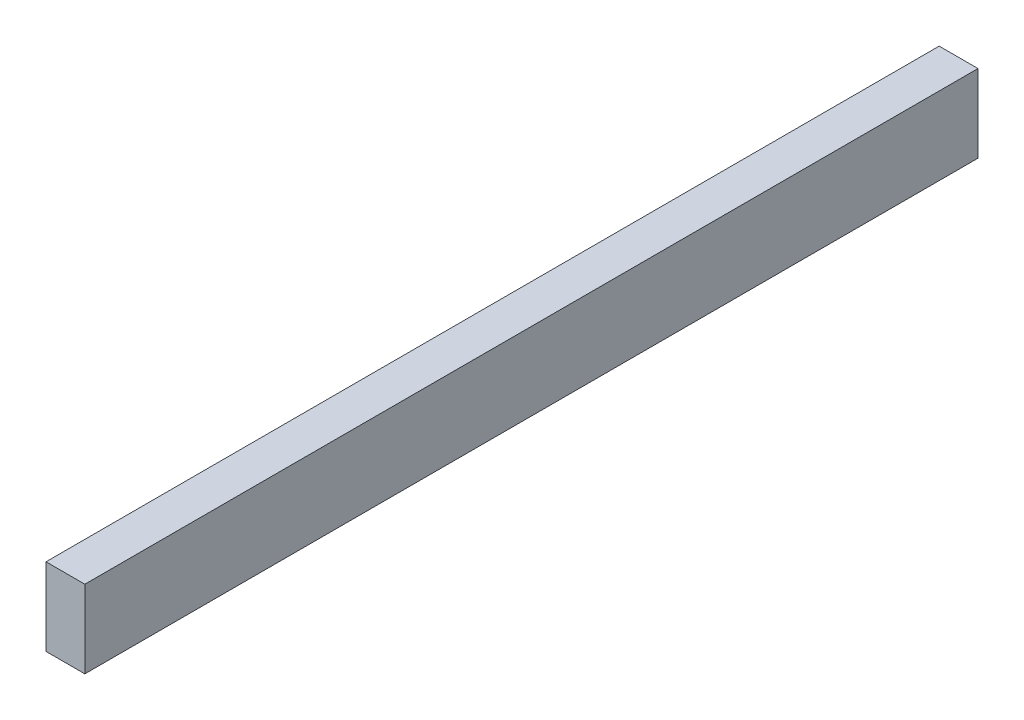
ISO-10303-21;
HEADER;
FILE_DESCRIPTION(('STEP AP214'),'2;1');
FILE_NAME('part.step','',(''),(''),'','','');
FILE_SCHEMA(('AUTOMOTIVE_DESIGN { 1 0 10303 214 1 1 1 1 }'));
ENDSEC;
DATA;
#1=APPLICATION_CONTEXT('core data for automotive mechanical design processes');
#2=APPLICATION_PROTOCOL_DEFINITION('international standard','automotive_design',2000,#1);
#3=PRODUCT_CONTEXT('',#1,'mechanical');
#4=PRODUCT('Part','Part','',(#3));
#5=PRODUCT_RELATED_PRODUCT_CATEGORY('part','',(#4));
#6=PRODUCT_DEFINITION_FORMATION('','',#4);
#7=PRODUCT_DEFINITION_CONTEXT('part definition',#1,'design');
#8=PRODUCT_DEFINITION('design','',#6,#7);
#9=PRODUCT_DEFINITION_SHAPE('','',#8);
#10=(LENGTH_UNIT() NAMED_UNIT(*) SI_UNIT(.MILLI.,.METRE.));
#11=(NAMED_UNIT(*) PLANE_ANGLE_UNIT() SI_UNIT($,.RADIAN.));
#12=(NAMED_UNIT(*) SI_UNIT($,.STERADIAN.) SOLID_ANGLE_UNIT());
#13=UNCERTAINTY_MEASURE_WITH_UNIT(LENGTH_MEASURE(1.E-05),#10,'distance_accuracy_value','');
#14=(GEOMETRIC_REPRESENTATION_CONTEXT(3) GLOBAL_UNCERTAINTY_ASSIGNED_CONTEXT((#13)) GLOBAL_UNIT_ASSIGNED_CONTEXT((#10,
#11,#12)) REPRESENTATION_CONTEXT('',''));
#15=CARTESIAN_POINT('',(0.,0.,0.));
#16=DIRECTION('',(0.,0.,1.));
#17=DIRECTION('',(1.,0.,0.));
#18=AXIS2_PLACEMENT_3D('',#15,#16,#17);
#19=CARTESIAN_POINT('',(12.7,25.4,584.2));
#20=DIRECTION('',(-1.,0.,0.));
#21=DIRECTION('',(0.,-1.,0.));
#22=AXIS2_PLACEMENT_3D('',#19,#20,#21);
#23=PLANE('',#22);
#24=DIRECTION('',(0.,1.,0.));
#25=VECTOR('',#24,1.);
#26=CARTESIAN_POINT('',(12.7,25.4,0.));
#27=LINE('',#26,#25);
#28=CARTESIAN_POINT('',(12.7,-25.4,0.));
#29=VERTEX_POINT('',#28);
#30=CARTESIAN_POINT('',(12.7,25.4,0.));
#31=VERTEX_POINT('',#30);
#32=EDGE_CURVE('E113',#29,#31,#27,.T.);
#33=ORIENTED_EDGE('',*,*,#32,.T.);
#34=DIRECTION('',(0.,0.,-1.));
#35=VECTOR('',#34,1.);
#36=CARTESIAN_POINT('',(12.7,25.4,584.2));
#37=LINE('',#36,#35);
#38=CARTESIAN_POINT('',(12.7,25.4,584.2));
#39=VERTEX_POINT('',#38);
#40=EDGE_CURVE('E11',#39,#31,#37,.T.);
#41=ORIENTED_EDGE('',*,*,#40,.F.);
#42=DIRECTION('',(0.,1.,0.));
#43=VECTOR('',#42,1.);
#44=CARTESIAN_POINT('',(12.7,25.4,584.2));
#45=LINE('',#44,#43);
#46=CARTESIAN_POINT('',(12.7,-25.4,584.2));
#47=VERTEX_POINT('',#46);
#48=EDGE_CURVE('E97',#47,#39,#45,.T.);
#49=ORIENTED_EDGE('',*,*,#48,.F.);
#50=DIRECTION('',(0.,0.,-1.));
#51=VECTOR('',#50,1.);
#52=CARTESIAN_POINT('',(12.7,-25.4,584.2));
#53=LINE('',#52,#51);
#54=EDGE_CURVE('E109',#47,#29,#53,.T.);
#55=ORIENTED_EDGE('',*,*,#54,.T.);
#56=EDGE_LOOP('',(#33,#41,#49,#55));
#57=FACE_BOUND('',#56,.T.);
#58=ADVANCED_FACE('F45',(#57),#23,.F.);
#59=CARTESIAN_POINT('',(-12.7,25.4,584.2));
#60=DIRECTION('',(0.,-1.,0.));
#61=DIRECTION('',(0.,0.,-1.));
#62=AXIS2_PLACEMENT_3D('',#59,#60,#61);
#63=PLANE('',#62);
#64=DIRECTION('',(-1.,0.,0.));
#65=VECTOR('',#64,1.);
#66=CARTESIAN_POINT('',(-12.7,25.4,0.));
#67=LINE('',#66,#65);
#68=CARTESIAN_POINT('',(-12.7,25.4,0.));
#69=VERTEX_POINT('',#68);
#70=EDGE_CURVE('E102',#31,#69,#67,.T.);
#71=ORIENTED_EDGE('',*,*,#70,.T.);
#72=DIRECTION('',(0.,0.,-1.));
#73=VECTOR('',#72,1.);
#74=CARTESIAN_POINT('',(-12.7,25.4,584.2));
#75=LINE('',#74,#73);
#76=CARTESIAN_POINT('',(-12.7,25.4,584.2));
#77=VERTEX_POINT('',#76);
#78=EDGE_CURVE('E54',#77,#69,#75,.T.);
#79=ORIENTED_EDGE('',*,*,#78,.F.);
#80=DIRECTION('',(-1.,0.,0.));
#81=VECTOR('',#80,1.);
#82=CARTESIAN_POINT('',(-12.7,25.4,584.2));
#83=LINE('',#82,#81);
#84=EDGE_CURVE('E92',#39,#77,#83,.T.);
#85=ORIENTED_EDGE('',*,*,#84,.F.);
#86=ORIENTED_EDGE('',*,*,#40,.T.);
#87=EDGE_LOOP('',(#71,#79,#85,#86));
#88=FACE_BOUND('',#87,.T.);
#89=ADVANCED_FACE('F101',(#88),#63,.F.);
#90=CARTESIAN_POINT('',(-12.7,25.4,584.2));
#91=DIRECTION('',(1.,0.,0.));
#92=DIRECTION('',(0.,1.,0.));
#93=AXIS2_PLACEMENT_3D('',#90,#91,#92);
#94=PLANE('',#93);
#95=DIRECTION('',(0.,-1.,0.));
#96=VECTOR('',#95,1.);
#97=CARTESIAN_POINT('',(-12.7,25.4,0.));
#98=LINE('',#97,#96);
#99=CARTESIAN_POINT('',(-12.7,-25.4,0.));
#100=VERTEX_POINT('',#99);
#101=EDGE_CURVE('E79',#69,#100,#98,.T.);
#102=ORIENTED_EDGE('',*,*,#101,.T.);
#103=DIRECTION('',(0.,0.,-1.));
#104=VECTOR('',#103,1.);
#105=CARTESIAN_POINT('',(-12.7,-25.4,584.2));
#106=LINE('',#105,#104);
#107=CARTESIAN_POINT('',(-12.7,-25.4,584.2));
#108=VERTEX_POINT('',#107);
#109=EDGE_CURVE('E104',#108,#100,#106,.T.);
#110=ORIENTED_EDGE('',*,*,#109,.F.);
#111=DIRECTION('',(0.,-1.,0.));
#112=VECTOR('',#111,1.);
#113=CARTESIAN_POINT('',(-12.7,25.4,584.2));
#114=LINE('',#113,#112);
#115=EDGE_CURVE('E95',#77,#108,#114,.T.);
#116=ORIENTED_EDGE('',*,*,#115,.F.);
#117=ORIENTED_EDGE('',*,*,#78,.T.);
#118=EDGE_LOOP('',(#102,#110,#116,#117));
#119=FACE_BOUND('',#118,.T.);
#120=ADVANCED_FACE('F105',(#119),#94,.F.);
#121=CARTESIAN_POINT('',(-12.7,-25.4,584.2));
#122=DIRECTION('',(0.,1.,0.));
#123=DIRECTION('',(0.,0.,1.));
#124=AXIS2_PLACEMENT_3D('',#121,#122,#123);
#125=PLANE('',#124);
#126=DIRECTION('',(1.,0.,0.));
#127=VECTOR('',#126,1.);
#128=CARTESIAN_POINT('',(-12.7,-25.4,0.));
#129=LINE('',#128,#127);
#130=EDGE_CURVE('E85',#100,#29,#129,.T.);
#131=ORIENTED_EDGE('',*,*,#130,.T.);
#132=ORIENTED_EDGE('',*,*,#54,.F.);
#133=DIRECTION('',(1.,0.,0.));
#134=VECTOR('',#133,1.);
#135=CARTESIAN_POINT('',(-12.7,-25.4,584.2));
#136=LINE('',#135,#134);
#137=EDGE_CURVE('E62',#108,#47,#136,.T.);
#138=ORIENTED_EDGE('',*,*,#137,.F.);
#139=ORIENTED_EDGE('',*,*,#109,.T.);
#140=EDGE_LOOP('',(#131,#132,#138,#139));
#141=FACE_BOUND('',#140,.T.);
#142=ADVANCED_FACE('F126',(#141),#125,.F.);
#143=CARTESIAN_POINT('',(0.,0.,584.2));
#144=DIRECTION('',(0.,0.,1.));
#145=DIRECTION('',(1.,0.,0.));
#146=AXIS2_PLACEMENT_3D('',#143,#144,#145);
#147=PLANE('',#146);
#148=ORIENTED_EDGE('',*,*,#48,.T.);
#149=ORIENTED_EDGE('',*,*,#84,.T.);
#150=ORIENTED_EDGE('',*,*,#115,.T.);
#151=ORIENTED_EDGE('',*,*,#137,.T.);
#152=EDGE_LOOP('',(#148,#149,#150,#151));
#153=FACE_BOUND('',#152,.T.);
#154=ADVANCED_FACE('F93',(#153),#147,.T.);
#155=CARTESIAN_POINT('',(0.,0.,0.));
#156=DIRECTION('',(0.,0.,1.));
#157=DIRECTION('',(1.,0.,0.));
#158=AXIS2_PLACEMENT_3D('',#155,#156,#157);
#159=PLANE('',#158);
#160=ORIENTED_EDGE('',*,*,#32,.F.);
#161=ORIENTED_EDGE('',*,*,#130,.F.);
#162=ORIENTED_EDGE('',*,*,#101,.F.);
#163=ORIENTED_EDGE('',*,*,#70,.F.);
#164=EDGE_LOOP('',(#160,#161,#162,#163));
#165=FACE_BOUND('',#164,.T.);
#166=ADVANCED_FACE('F129',(#165),#159,.F.);
#167=CLOSED_SHELL('',(#58,#89,#120,#142,#154,#166));
#168=MANIFOLD_SOLID_BREP('B2',#167);
#169=ADVANCED_BREP_SHAPE_REPRESENTATION('',(#18,#168),#14);
#170=SHAPE_DEFINITION_REPRESENTATION(#9,#169);
ENDSEC;
END-ISO-10303-21;
